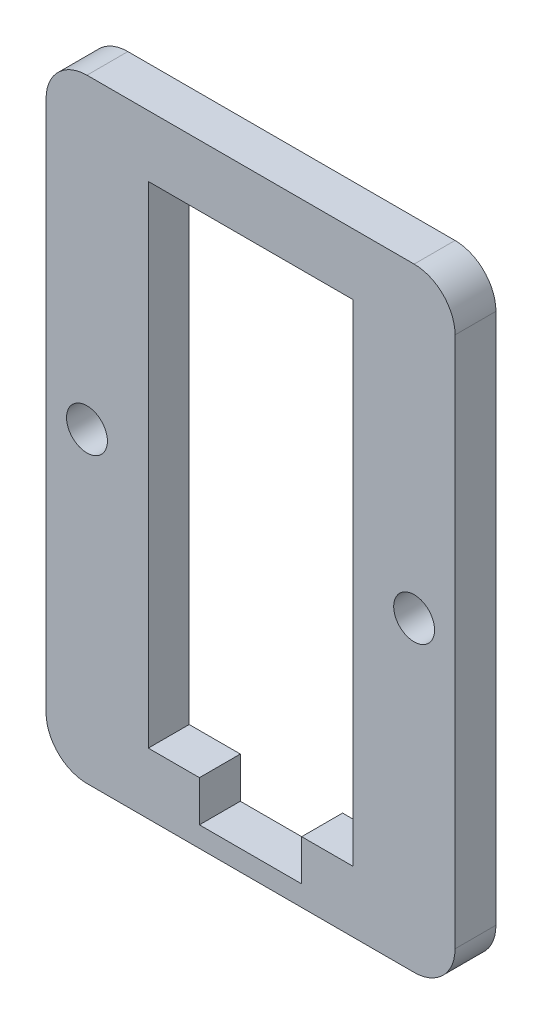
ISO-10303-21;
HEADER;
FILE_DESCRIPTION(('STEP AP214'),'2;1');
FILE_NAME('part.step','',(''),(''),'','','');
FILE_SCHEMA(('AUTOMOTIVE_DESIGN { 1 0 10303 214 1 1 1 1 }'));
ENDSEC;
DATA;
#1=APPLICATION_CONTEXT('core data for automotive mechanical design processes');
#2=APPLICATION_PROTOCOL_DEFINITION('international standard','automotive_design',2000,#1);
#3=PRODUCT_CONTEXT('',#1,'mechanical');
#4=PRODUCT('Part','Part','',(#3));
#5=PRODUCT_RELATED_PRODUCT_CATEGORY('part','',(#4));
#6=PRODUCT_DEFINITION_FORMATION('','',#4);
#7=PRODUCT_DEFINITION_CONTEXT('part definition',#1,'design');
#8=PRODUCT_DEFINITION('design','',#6,#7);
#9=PRODUCT_DEFINITION_SHAPE('','',#8);
#10=(LENGTH_UNIT() NAMED_UNIT(*) SI_UNIT(.MILLI.,.METRE.));
#11=(NAMED_UNIT(*) PLANE_ANGLE_UNIT() SI_UNIT($,.RADIAN.));
#12=(NAMED_UNIT(*) SI_UNIT($,.STERADIAN.) SOLID_ANGLE_UNIT());
#13=UNCERTAINTY_MEASURE_WITH_UNIT(LENGTH_MEASURE(1.E-05),#10,'distance_accuracy_value','');
#14=(GEOMETRIC_REPRESENTATION_CONTEXT(3) GLOBAL_UNCERTAINTY_ASSIGNED_CONTEXT((#13)) GLOBAL_UNIT_ASSIGNED_CONTEXT((#10,
#11,#12)) REPRESENTATION_CONTEXT('',''));
#15=CARTESIAN_POINT('',(0.,0.,0.));
#16=DIRECTION('',(0.,0.,1.));
#17=DIRECTION('',(1.,0.,0.));
#18=AXIS2_PLACEMENT_3D('',#15,#16,#17);
#19=CARTESIAN_POINT('',(-8.,0.,0.));
#20=DIRECTION('',(0.,0.,-1.));
#21=DIRECTION('',(1.,0.,0.));
#22=AXIS2_PLACEMENT_3D('',#19,#20,#21);
#23=CYLINDRICAL_SURFACE('',#22,1.);
#24=DIRECTION('',(0.,0.,1.));
#25=VECTOR('',#24,1.);
#26=CARTESIAN_POINT('',(-7.,0.,0.));
#27=LINE('',#26,#25);
#28=CARTESIAN_POINT('',(-7.,0.,0.));
#29=VERTEX_POINT('',#28);
#30=CARTESIAN_POINT('',(-7.,0.,2.));
#31=VERTEX_POINT('',#30);
#32=EDGE_CURVE('E9',#29,#31,#27,.T.);
#33=ORIENTED_EDGE('',*,*,#32,.T.);
#34=CARTESIAN_POINT('',(-8.,0.,2.));
#35=DIRECTION('',(0.,0.,1.));
#36=DIRECTION('',(1.,0.,0.));
#37=AXIS2_PLACEMENT_3D('',#34,#35,#36);
#38=CIRCLE('',#37,1.);
#39=EDGE_CURVE('E256',#31,#31,#38,.T.);
#40=ORIENTED_EDGE('',*,*,#39,.T.);
#41=ORIENTED_EDGE('',*,*,#32,.F.);
#42=CARTESIAN_POINT('',(-8.,0.,0.));
#43=DIRECTION('',(0.,0.,1.));
#44=DIRECTION('',(1.,0.,0.));
#45=AXIS2_PLACEMENT_3D('',#42,#43,#44);
#46=CIRCLE('',#45,1.);
#47=EDGE_CURVE('E317',#29,#29,#46,.T.);
#48=ORIENTED_EDGE('',*,*,#47,.F.);
#49=EDGE_LOOP('',(#33,#40,#41,#48));
#50=FACE_BOUND('',#49,.T.);
#51=ADVANCED_FACE('F14',(#50),#23,.F.);
#52=CARTESIAN_POINT('',(8.,0.,0.));
#53=DIRECTION('',(0.,0.,-1.));
#54=DIRECTION('',(1.,0.,0.));
#55=AXIS2_PLACEMENT_3D('',#52,#53,#54);
#56=CYLINDRICAL_SURFACE('',#55,1.);
#57=DIRECTION('',(0.,0.,1.));
#58=VECTOR('',#57,1.);
#59=CARTESIAN_POINT('',(9.,0.,0.));
#60=LINE('',#59,#58);
#61=CARTESIAN_POINT('',(9.,0.,0.));
#62=VERTEX_POINT('',#61);
#63=CARTESIAN_POINT('',(9.,0.,2.));
#64=VERTEX_POINT('',#63);
#65=EDGE_CURVE('E25',#62,#64,#60,.T.);
#66=ORIENTED_EDGE('',*,*,#65,.T.);
#67=CARTESIAN_POINT('',(8.,0.,2.));
#68=DIRECTION('',(0.,0.,1.));
#69=DIRECTION('',(1.,0.,0.));
#70=AXIS2_PLACEMENT_3D('',#67,#68,#69);
#71=CIRCLE('',#70,1.);
#72=EDGE_CURVE('E252',#64,#64,#71,.T.);
#73=ORIENTED_EDGE('',*,*,#72,.T.);
#74=ORIENTED_EDGE('',*,*,#65,.F.);
#75=CARTESIAN_POINT('',(8.,0.,0.));
#76=DIRECTION('',(0.,0.,1.));
#77=DIRECTION('',(1.,0.,0.));
#78=AXIS2_PLACEMENT_3D('',#75,#76,#77);
#79=CIRCLE('',#78,1.);
#80=EDGE_CURVE('E210',#62,#62,#79,.T.);
#81=ORIENTED_EDGE('',*,*,#80,.F.);
#82=EDGE_LOOP('',(#66,#73,#74,#81));
#83=FACE_BOUND('',#82,.T.);
#84=ADVANCED_FACE('F444',(#83),#56,.F.);
#85=CARTESIAN_POINT('',(-5.,12.,0.));
#86=DIRECTION('',(1.,0.,0.));
#87=DIRECTION('',(0.,1.,0.));
#88=AXIS2_PLACEMENT_3D('',#85,#86,#87);
#89=PLANE('',#88);
#90=DIRECTION('',(0.,0.,1.));
#91=VECTOR('',#90,1.);
#92=CARTESIAN_POINT('',(-5.,12.,0.));
#93=LINE('',#92,#91);
#94=CARTESIAN_POINT('',(-5.,12.,0.));
#95=VERTEX_POINT('',#94);
#96=CARTESIAN_POINT('',(-5.,12.,2.));
#97=VERTEX_POINT('',#96);
#98=EDGE_CURVE('E115',#95,#97,#93,.T.);
#99=ORIENTED_EDGE('',*,*,#98,.T.);
#100=DIRECTION('',(0.,-1.,0.));
#101=VECTOR('',#100,1.);
#102=CARTESIAN_POINT('',(-5.,12.,2.));
#103=LINE('',#102,#101);
#104=CARTESIAN_POINT('',(-5.,-12.,2.));
#105=VERTEX_POINT('',#104);
#106=EDGE_CURVE('E257',#97,#105,#103,.T.);
#107=ORIENTED_EDGE('',*,*,#106,.T.);
#108=DIRECTION('',(0.,0.,1.));
#109=VECTOR('',#108,1.);
#110=CARTESIAN_POINT('',(-5.,-12.,0.));
#111=LINE('',#110,#109);
#112=CARTESIAN_POINT('',(-5.,-12.,0.));
#113=VERTEX_POINT('',#112);
#114=EDGE_CURVE('E213',#113,#105,#111,.T.);
#115=ORIENTED_EDGE('',*,*,#114,.F.);
#116=DIRECTION('',(0.,-1.,0.));
#117=VECTOR('',#116,1.);
#118=CARTESIAN_POINT('',(-5.,12.,0.));
#119=LINE('',#118,#117);
#120=EDGE_CURVE('E206',#95,#113,#119,.T.);
#121=ORIENTED_EDGE('',*,*,#120,.F.);
#122=EDGE_LOOP('',(#99,#107,#115,#121));
#123=FACE_BOUND('',#122,.T.);
#124=ADVANCED_FACE('F212',(#123),#89,.T.);
#125=CARTESIAN_POINT('',(-5.,-12.,0.));
#126=DIRECTION('',(0.,1.,0.));
#127=DIRECTION('',(1.,0.,0.));
#128=AXIS2_PLACEMENT_3D('',#125,#126,#127);
#129=PLANE('',#128);
#130=ORIENTED_EDGE('',*,*,#114,.T.);
#131=DIRECTION('',(1.,0.,0.));
#132=VECTOR('',#131,1.);
#133=CARTESIAN_POINT('',(-5.,-12.,2.));
#134=LINE('',#133,#132);
#135=CARTESIAN_POINT('',(-2.5,-12.,2.));
#136=VERTEX_POINT('',#135);
#137=EDGE_CURVE('E274',#105,#136,#134,.T.);
#138=ORIENTED_EDGE('',*,*,#137,.T.);
#139=DIRECTION('',(0.,0.,1.));
#140=VECTOR('',#139,1.);
#141=CARTESIAN_POINT('',(-2.5,-12.,0.));
#142=LINE('',#141,#140);
#143=CARTESIAN_POINT('',(-2.5,-12.,0.));
#144=VERTEX_POINT('',#143);
#145=EDGE_CURVE('E334',#144,#136,#142,.T.);
#146=ORIENTED_EDGE('',*,*,#145,.F.);
#147=DIRECTION('',(1.,0.,0.));
#148=VECTOR('',#147,1.);
#149=CARTESIAN_POINT('',(-5.,-12.,0.));
#150=LINE('',#149,#148);
#151=EDGE_CURVE('E216',#113,#144,#150,.T.);
#152=ORIENTED_EDGE('',*,*,#151,.F.);
#153=EDGE_LOOP('',(#130,#138,#146,#152));
#154=FACE_BOUND('',#153,.T.);
#155=ADVANCED_FACE('F397',(#154),#129,.T.);
#156=CARTESIAN_POINT('',(-2.5,-12.,0.));
#157=DIRECTION('',(1.,0.,0.));
#158=DIRECTION('',(0.,1.,0.));
#159=AXIS2_PLACEMENT_3D('',#156,#157,#158);
#160=PLANE('',#159);
#161=ORIENTED_EDGE('',*,*,#145,.T.);
#162=DIRECTION('',(0.,-1.,0.));
#163=VECTOR('',#162,1.);
#164=CARTESIAN_POINT('',(-2.5,-12.,2.));
#165=LINE('',#164,#163);
#166=CARTESIAN_POINT('',(-2.5,-14.,2.));
#167=VERTEX_POINT('',#166);
#168=EDGE_CURVE('E240',#136,#167,#165,.T.);
#169=ORIENTED_EDGE('',*,*,#168,.T.);
#170=DIRECTION('',(0.,0.,1.));
#171=VECTOR('',#170,1.);
#172=CARTESIAN_POINT('',(-2.5,-14.,0.));
#173=LINE('',#172,#171);
#174=CARTESIAN_POINT('',(-2.5,-14.,0.));
#175=VERTEX_POINT('',#174);
#176=EDGE_CURVE('E164',#175,#167,#173,.T.);
#177=ORIENTED_EDGE('',*,*,#176,.F.);
#178=DIRECTION('',(0.,-1.,0.));
#179=VECTOR('',#178,1.);
#180=CARTESIAN_POINT('',(-2.5,-12.,0.));
#181=LINE('',#180,#179);
#182=EDGE_CURVE('E18',#144,#175,#181,.T.);
#183=ORIENTED_EDGE('',*,*,#182,.F.);
#184=EDGE_LOOP('',(#161,#169,#177,#183));
#185=FACE_BOUND('',#184,.T.);
#186=ADVANCED_FACE('F465',(#185),#160,.T.);
#187=CARTESIAN_POINT('',(-2.5,-14.,0.));
#188=DIRECTION('',(0.,1.,0.));
#189=DIRECTION('',(1.,0.,0.));
#190=AXIS2_PLACEMENT_3D('',#187,#188,#189);
#191=PLANE('',#190);
#192=ORIENTED_EDGE('',*,*,#176,.T.);
#193=DIRECTION('',(1.,0.,0.));
#194=VECTOR('',#193,1.);
#195=CARTESIAN_POINT('',(-2.5,-14.,2.));
#196=LINE('',#195,#194);
#197=CARTESIAN_POINT('',(2.5,-14.,2.));
#198=VERTEX_POINT('',#197);
#199=EDGE_CURVE('E237',#167,#198,#196,.T.);
#200=ORIENTED_EDGE('',*,*,#199,.T.);
#201=DIRECTION('',(0.,0.,1.));
#202=VECTOR('',#201,1.);
#203=CARTESIAN_POINT('',(2.5,-14.,0.));
#204=LINE('',#203,#202);
#205=CARTESIAN_POINT('',(2.5,-14.,0.));
#206=VERTEX_POINT('',#205);
#207=EDGE_CURVE('E174',#206,#198,#204,.T.);
#208=ORIENTED_EDGE('',*,*,#207,.F.);
#209=DIRECTION('',(1.,0.,0.));
#210=VECTOR('',#209,1.);
#211=CARTESIAN_POINT('',(-2.5,-14.,0.));
#212=LINE('',#211,#210);
#213=EDGE_CURVE('E281',#175,#206,#212,.T.);
#214=ORIENTED_EDGE('',*,*,#213,.F.);
#215=EDGE_LOOP('',(#192,#200,#208,#214));
#216=FACE_BOUND('',#215,.T.);
#217=ADVANCED_FACE('F453',(#216),#191,.T.);
#218=CARTESIAN_POINT('',(2.5,-12.,0.));
#219=DIRECTION('',(1.,0.,0.));
#220=DIRECTION('',(0.,1.,0.));
#221=AXIS2_PLACEMENT_3D('',#218,#219,#220);
#222=PLANE('',#221);
#223=DIRECTION('',(0.,-1.,0.));
#224=VECTOR('',#223,1.);
#225=CARTESIAN_POINT('',(2.5,-12.,0.));
#226=LINE('',#225,#224);
#227=CARTESIAN_POINT('',(2.5,-12.,0.));
#228=VERTEX_POINT('',#227);
#229=EDGE_CURVE('E278',#228,#206,#226,.T.);
#230=ORIENTED_EDGE('',*,*,#229,.T.);
#231=ORIENTED_EDGE('',*,*,#207,.T.);
#232=DIRECTION('',(0.,-1.,0.));
#233=VECTOR('',#232,1.);
#234=CARTESIAN_POINT('',(2.5,-12.,2.));
#235=LINE('',#234,#233);
#236=CARTESIAN_POINT('',(2.5,-12.,2.));
#237=VERTEX_POINT('',#236);
#238=EDGE_CURVE('E241',#237,#198,#235,.T.);
#239=ORIENTED_EDGE('',*,*,#238,.F.);
#240=DIRECTION('',(0.,0.,1.));
#241=VECTOR('',#240,1.);
#242=CARTESIAN_POINT('',(2.5,-12.,0.));
#243=LINE('',#242,#241);
#244=EDGE_CURVE('E285',#228,#237,#243,.T.);
#245=ORIENTED_EDGE('',*,*,#244,.F.);
#246=EDGE_LOOP('',(#230,#231,#239,#245));
#247=FACE_BOUND('',#246,.T.);
#248=ADVANCED_FACE('F458',(#247),#222,.F.);
#249=CARTESIAN_POINT('',(5.,-12.,0.));
#250=DIRECTION('',(0.,-1.,0.));
#251=DIRECTION('',(0.,0.,-1.));
#252=AXIS2_PLACEMENT_3D('',#249,#250,#251);
#253=PLANE('',#252);
#254=DIRECTION('',(-1.,0.,0.));
#255=VECTOR('',#254,1.);
#256=CARTESIAN_POINT('',(5.,-12.,0.));
#257=LINE('',#256,#255);
#258=CARTESIAN_POINT('',(5.,-12.,0.));
#259=VERTEX_POINT('',#258);
#260=EDGE_CURVE('E280',#259,#228,#257,.T.);
#261=ORIENTED_EDGE('',*,*,#260,.T.);
#262=ORIENTED_EDGE('',*,*,#244,.T.);
#263=DIRECTION('',(-1.,0.,0.));
#264=VECTOR('',#263,1.);
#265=CARTESIAN_POINT('',(5.,-12.,2.));
#266=LINE('',#265,#264);
#267=CARTESIAN_POINT('',(5.,-12.,2.));
#268=VERTEX_POINT('',#267);
#269=EDGE_CURVE('E251',#268,#237,#266,.T.);
#270=ORIENTED_EDGE('',*,*,#269,.F.);
#271=DIRECTION('',(0.,0.,1.));
#272=VECTOR('',#271,1.);
#273=CARTESIAN_POINT('',(5.,-12.,0.));
#274=LINE('',#273,#272);
#275=EDGE_CURVE('E95',#259,#268,#274,.T.);
#276=ORIENTED_EDGE('',*,*,#275,.F.);
#277=EDGE_LOOP('',(#261,#262,#270,#276));
#278=FACE_BOUND('',#277,.T.);
#279=ADVANCED_FACE('F388',(#278),#253,.F.);
#280=CARTESIAN_POINT('',(5.,12.,0.));
#281=DIRECTION('',(1.,0.,0.));
#282=DIRECTION('',(0.,1.,0.));
#283=AXIS2_PLACEMENT_3D('',#280,#281,#282);
#284=PLANE('',#283);
#285=DIRECTION('',(0.,-1.,0.));
#286=VECTOR('',#285,1.);
#287=CARTESIAN_POINT('',(5.,12.,0.));
#288=LINE('',#287,#286);
#289=CARTESIAN_POINT('',(5.,12.,0.));
#290=VERTEX_POINT('',#289);
#291=EDGE_CURVE('E208',#290,#259,#288,.T.);
#292=ORIENTED_EDGE('',*,*,#291,.T.);
#293=ORIENTED_EDGE('',*,*,#275,.T.);
#294=DIRECTION('',(0.,-1.,0.));
#295=VECTOR('',#294,1.);
#296=CARTESIAN_POINT('',(5.,12.,2.));
#297=LINE('',#296,#295);
#298=CARTESIAN_POINT('',(5.,12.,2.));
#299=VERTEX_POINT('',#298);
#300=EDGE_CURVE('E289',#299,#268,#297,.T.);
#301=ORIENTED_EDGE('',*,*,#300,.F.);
#302=DIRECTION('',(0.,0.,1.));
#303=VECTOR('',#302,1.);
#304=CARTESIAN_POINT('',(5.,12.,0.));
#305=LINE('',#304,#303);
#306=EDGE_CURVE('E107',#290,#299,#305,.T.);
#307=ORIENTED_EDGE('',*,*,#306,.F.);
#308=EDGE_LOOP('',(#292,#293,#301,#307));
#309=FACE_BOUND('',#308,.T.);
#310=ADVANCED_FACE('F383',(#309),#284,.F.);
#311=CARTESIAN_POINT('',(-5.,12.,0.));
#312=DIRECTION('',(0.,1.,0.));
#313=DIRECTION('',(1.,0.,0.));
#314=AXIS2_PLACEMENT_3D('',#311,#312,#313);
#315=PLANE('',#314);
#316=DIRECTION('',(1.,0.,0.));
#317=VECTOR('',#316,1.);
#318=CARTESIAN_POINT('',(-5.,12.,0.));
#319=LINE('',#318,#317);
#320=EDGE_CURVE('E195',#95,#290,#319,.T.);
#321=ORIENTED_EDGE('',*,*,#320,.T.);
#322=ORIENTED_EDGE('',*,*,#306,.T.);
#323=DIRECTION('',(1.,0.,0.));
#324=VECTOR('',#323,1.);
#325=CARTESIAN_POINT('',(-5.,12.,2.));
#326=LINE('',#325,#324);
#327=EDGE_CURVE('E198',#97,#299,#326,.T.);
#328=ORIENTED_EDGE('',*,*,#327,.F.);
#329=ORIENTED_EDGE('',*,*,#98,.F.);
#330=EDGE_LOOP('',(#321,#322,#328,#329));
#331=FACE_BOUND('',#330,.T.);
#332=ADVANCED_FACE('F194',(#331),#315,.F.);
#333=CARTESIAN_POINT('',(10.,-15.,0.));
#334=DIRECTION('',(-1.,0.,0.));
#335=DIRECTION('',(0.,0.,1.));
#336=AXIS2_PLACEMENT_3D('',#333,#334,#335);
#337=PLANE('',#336);
#338=DIRECTION('',(0.,0.,1.));
#339=VECTOR('',#338,1.);
#340=CARTESIAN_POINT('',(10.,13.,0.));
#341=LINE('',#340,#339);
#342=CARTESIAN_POINT('',(10.,13.,0.));
#343=VERTEX_POINT('',#342);
#344=CARTESIAN_POINT('',(10.,13.,2.));
#345=VERTEX_POINT('',#344);
#346=EDGE_CURVE('E227',#343,#345,#341,.T.);
#347=ORIENTED_EDGE('',*,*,#346,.T.);
#348=DIRECTION('',(0.,1.,0.));
#349=VECTOR('',#348,1.);
#350=CARTESIAN_POINT('',(10.,-15.,2.));
#351=LINE('',#350,#349);
#352=CARTESIAN_POINT('',(10.,-13.,2.));
#353=VERTEX_POINT('',#352);
#354=EDGE_CURVE('E312',#353,#345,#351,.T.);
#355=ORIENTED_EDGE('',*,*,#354,.F.);
#356=DIRECTION('',(0.,0.,1.));
#357=VECTOR('',#356,1.);
#358=CARTESIAN_POINT('',(10.,-13.,0.));
#359=LINE('',#358,#357);
#360=CARTESIAN_POINT('',(10.,-13.,0.));
#361=VERTEX_POINT('',#360);
#362=EDGE_CURVE('E230',#361,#353,#359,.T.);
#363=ORIENTED_EDGE('',*,*,#362,.F.);
#364=DIRECTION('',(0.,1.,0.));
#365=VECTOR('',#364,1.);
#366=CARTESIAN_POINT('',(10.,-15.,0.));
#367=LINE('',#366,#365);
#368=EDGE_CURVE('E235',#361,#343,#367,.T.);
#369=ORIENTED_EDGE('',*,*,#368,.T.);
#370=EDGE_LOOP('',(#347,#355,#363,#369));
#371=FACE_BOUND('',#370,.T.);
#372=ADVANCED_FACE('F454',(#371),#337,.F.);
#373=CARTESIAN_POINT('',(8.,-13.,0.));
#374=DIRECTION('',(0.,0.,1.));
#375=DIRECTION('',(0.,-1.,0.));
#376=AXIS2_PLACEMENT_3D('',#373,#374,#375);
#377=CYLINDRICAL_SURFACE('',#376,2.);
#378=CARTESIAN_POINT('',(8.,-13.,0.));
#379=DIRECTION('',(0.,0.,1.));
#380=DIRECTION('',(0.,-1.,0.));
#381=AXIS2_PLACEMENT_3D('',#378,#379,#380);
#382=CIRCLE('',#381,2.);
#383=CARTESIAN_POINT('',(8.,-15.,0.));
#384=VERTEX_POINT('',#383);
#385=EDGE_CURVE('E264',#384,#361,#382,.T.);
#386=ORIENTED_EDGE('',*,*,#385,.T.);
#387=ORIENTED_EDGE('',*,*,#362,.T.);
#388=CARTESIAN_POINT('',(8.,-13.,2.));
#389=DIRECTION('',(0.,0.,1.));
#390=DIRECTION('',(0.,-1.,0.));
#391=AXIS2_PLACEMENT_3D('',#388,#389,#390);
#392=CIRCLE('',#391,2.);
#393=CARTESIAN_POINT('',(8.,-15.,2.));
#394=VERTEX_POINT('',#393);
#395=EDGE_CURVE('E316',#394,#353,#392,.T.);
#396=ORIENTED_EDGE('',*,*,#395,.F.);
#397=DIRECTION('',(0.,0.,1.));
#398=VECTOR('',#397,1.);
#399=CARTESIAN_POINT('',(8.,-15.,0.));
#400=LINE('',#399,#398);
#401=EDGE_CURVE('E231',#384,#394,#400,.T.);
#402=ORIENTED_EDGE('',*,*,#401,.F.);
#403=EDGE_LOOP('',(#386,#387,#396,#402));
#404=FACE_BOUND('',#403,.T.);
#405=ADVANCED_FACE('F16',(#404),#377,.T.);
#406=CARTESIAN_POINT('',(8.,13.,0.));
#407=DIRECTION('',(0.,0.,1.));
#408=DIRECTION('',(1.,0.,0.));
#409=AXIS2_PLACEMENT_3D('',#406,#407,#408);
#410=CYLINDRICAL_SURFACE('',#409,2.);
#411=CARTESIAN_POINT('',(8.,13.,0.));
#412=DIRECTION('',(0.,0.,1.));
#413=DIRECTION('',(0.,-1.,0.));
#414=AXIS2_PLACEMENT_3D('',#411,#412,#413);
#415=CIRCLE('',#414,2.);
#416=CARTESIAN_POINT('',(8.,15.,0.));
#417=VERTEX_POINT('',#416);
#418=EDGE_CURVE('E232',#343,#417,#415,.T.);
#419=ORIENTED_EDGE('',*,*,#418,.T.);
#420=DIRECTION('',(0.,0.,1.));
#421=VECTOR('',#420,1.);
#422=CARTESIAN_POINT('',(8.,15.,0.));
#423=LINE('',#422,#421);
#424=CARTESIAN_POINT('',(8.,15.,2.));
#425=VERTEX_POINT('',#424);
#426=EDGE_CURVE('E127',#417,#425,#423,.T.);
#427=ORIENTED_EDGE('',*,*,#426,.T.);
#428=CARTESIAN_POINT('',(8.,13.,2.));
#429=DIRECTION('',(0.,0.,1.));
#430=DIRECTION('',(0.,-1.,0.));
#431=AXIS2_PLACEMENT_3D('',#428,#429,#430);
#432=CIRCLE('',#431,2.);
#433=EDGE_CURVE('E299',#345,#425,#432,.T.);
#434=ORIENTED_EDGE('',*,*,#433,.F.);
#435=ORIENTED_EDGE('',*,*,#346,.F.);
#436=EDGE_LOOP('',(#419,#427,#434,#435));
#437=FACE_BOUND('',#436,.T.);
#438=ADVANCED_FACE('F476',(#437),#410,.T.);
#439=CARTESIAN_POINT('',(-10.,-15.,0.));
#440=DIRECTION('',(0.,1.,0.));
#441=DIRECTION('',(1.,0.,0.));
#442=AXIS2_PLACEMENT_3D('',#439,#440,#441);
#443=PLANE('',#442);
#444=ORIENTED_EDGE('',*,*,#401,.T.);
#445=DIRECTION('',(1.,0.,0.));
#446=VECTOR('',#445,1.);
#447=CARTESIAN_POINT('',(-10.,-15.,2.));
#448=LINE('',#447,#446);
#449=CARTESIAN_POINT('',(-8.,-15.,2.));
#450=VERTEX_POINT('',#449);
#451=EDGE_CURVE('E322',#450,#394,#448,.T.);
#452=ORIENTED_EDGE('',*,*,#451,.F.);
#453=DIRECTION('',(0.,0.,1.));
#454=VECTOR('',#453,1.);
#455=CARTESIAN_POINT('',(-8.,-15.,0.));
#456=LINE('',#455,#454);
#457=CARTESIAN_POINT('',(-8.,-15.,0.));
#458=VERTEX_POINT('',#457);
#459=EDGE_CURVE('E190',#458,#450,#456,.T.);
#460=ORIENTED_EDGE('',*,*,#459,.F.);
#461=DIRECTION('',(1.,0.,0.));
#462=VECTOR('',#461,1.);
#463=CARTESIAN_POINT('',(-10.,-15.,0.));
#464=LINE('',#463,#462);
#465=EDGE_CURVE('E224',#458,#384,#464,.T.);
#466=ORIENTED_EDGE('',*,*,#465,.T.);
#467=EDGE_LOOP('',(#444,#452,#460,#466));
#468=FACE_BOUND('',#467,.T.);
#469=ADVANCED_FACE('F474',(#468),#443,.F.);
#470=CARTESIAN_POINT('',(10.,15.,0.));
#471=DIRECTION('',(0.,-1.,0.));
#472=DIRECTION('',(0.,0.,-1.));
#473=AXIS2_PLACEMENT_3D('',#470,#471,#472);
#474=PLANE('',#473);
#475=DIRECTION('',(0.,0.,1.));
#476=VECTOR('',#475,1.);
#477=CARTESIAN_POINT('',(-8.,15.,0.));
#478=LINE('',#477,#476);
#479=CARTESIAN_POINT('',(-8.,15.,0.));
#480=VERTEX_POINT('',#479);
#481=CARTESIAN_POINT('',(-8.,15.,2.));
#482=VERTEX_POINT('',#481);
#483=EDGE_CURVE('E341',#480,#482,#478,.T.);
#484=ORIENTED_EDGE('',*,*,#483,.T.);
#485=DIRECTION('',(-1.,0.,0.));
#486=VECTOR('',#485,1.);
#487=CARTESIAN_POINT('',(10.,15.,2.));
#488=LINE('',#487,#486);
#489=EDGE_CURVE('E296',#425,#482,#488,.T.);
#490=ORIENTED_EDGE('',*,*,#489,.F.);
#491=ORIENTED_EDGE('',*,*,#426,.F.);
#492=DIRECTION('',(-1.,0.,0.));
#493=VECTOR('',#492,1.);
#494=CARTESIAN_POINT('',(10.,15.,0.));
#495=LINE('',#494,#493);
#496=EDGE_CURVE('E236',#417,#480,#495,.T.);
#497=ORIENTED_EDGE('',*,*,#496,.T.);
#498=EDGE_LOOP('',(#484,#490,#491,#497));
#499=FACE_BOUND('',#498,.T.);
#500=ADVANCED_FACE('F438',(#499),#474,.F.);
#501=CARTESIAN_POINT('',(0.,-0.339926621644,2.));
#502=DIRECTION('',(0.,0.,1.));
#503=DIRECTION('',(1.,0.,0.));
#504=AXIS2_PLACEMENT_3D('',#501,#502,#503);
#505=PLANE('',#504);
#506=ORIENTED_EDGE('',*,*,#39,.F.);
#507=EDGE_LOOP('',(#506));
#508=FACE_BOUND('',#507,.T.);
#509=ORIENTED_EDGE('',*,*,#72,.F.);
#510=EDGE_LOOP('',(#509));
#511=FACE_BOUND('',#510,.T.);
#512=ORIENTED_EDGE('',*,*,#327,.T.);
#513=ORIENTED_EDGE('',*,*,#300,.T.);
#514=ORIENTED_EDGE('',*,*,#269,.T.);
#515=ORIENTED_EDGE('',*,*,#238,.T.);
#516=ORIENTED_EDGE('',*,*,#199,.F.);
#517=ORIENTED_EDGE('',*,*,#168,.F.);
#518=ORIENTED_EDGE('',*,*,#137,.F.);
#519=ORIENTED_EDGE('',*,*,#106,.F.);
#520=EDGE_LOOP('',(#512,#513,#514,#515,#516,#517,#518,#519));
#521=FACE_BOUND('',#520,.T.);
#522=DIRECTION('',(0.,-1.,0.));
#523=VECTOR('',#522,1.);
#524=CARTESIAN_POINT('',(-10.,15.,2.));
#525=LINE('',#524,#523);
#526=CARTESIAN_POINT('',(-10.,13.,2.));
#527=VERTEX_POINT('',#526);
#528=CARTESIAN_POINT('',(-10.,-13.,2.));
#529=VERTEX_POINT('',#528);
#530=EDGE_CURVE('E247',#527,#529,#525,.T.);
#531=ORIENTED_EDGE('',*,*,#530,.T.);
#532=CARTESIAN_POINT('',(-8.,-13.,2.));
#533=DIRECTION('',(0.,0.,1.));
#534=DIRECTION('',(0.,-1.,0.));
#535=AXIS2_PLACEMENT_3D('',#532,#533,#534);
#536=CIRCLE('',#535,2.);
#537=EDGE_CURVE('E326',#529,#450,#536,.T.);
#538=ORIENTED_EDGE('',*,*,#537,.T.);
#539=ORIENTED_EDGE('',*,*,#451,.T.);
#540=ORIENTED_EDGE('',*,*,#395,.T.);
#541=ORIENTED_EDGE('',*,*,#354,.T.);
#542=ORIENTED_EDGE('',*,*,#433,.T.);
#543=ORIENTED_EDGE('',*,*,#489,.T.);
#544=CARTESIAN_POINT('',(-8.,13.,2.));
#545=DIRECTION('',(0.,0.,-1.));
#546=DIRECTION('',(0.,-1.,0.));
#547=AXIS2_PLACEMENT_3D('',#544,#545,#546);
#548=CIRCLE('',#547,2.);
#549=EDGE_CURVE('E321',#527,#482,#548,.T.);
#550=ORIENTED_EDGE('',*,*,#549,.F.);
#551=EDGE_LOOP('',(#531,#538,#539,#540,#541,#542,#543,#550));
#552=FACE_BOUND('',#551,.T.);
#553=ADVANCED_FACE('F391',(#508,#511,#521,#552),#505,.T.);
#554=CARTESIAN_POINT('',(-8.,-13.,0.));
#555=DIRECTION('',(0.,0.,1.));
#556=DIRECTION('',(-1.,0.,0.));
#557=AXIS2_PLACEMENT_3D('',#554,#555,#556);
#558=CYLINDRICAL_SURFACE('',#557,2.);
#559=CARTESIAN_POINT('',(-8.,-13.,0.));
#560=DIRECTION('',(0.,0.,1.));
#561=DIRECTION('',(0.,-1.,0.));
#562=AXIS2_PLACEMENT_3D('',#559,#560,#561);
#563=CIRCLE('',#562,2.);
#564=CARTESIAN_POINT('',(-10.,-13.,0.));
#565=VERTEX_POINT('',#564);
#566=EDGE_CURVE('E217',#565,#458,#563,.T.);
#567=ORIENTED_EDGE('',*,*,#566,.T.);
#568=ORIENTED_EDGE('',*,*,#459,.T.);
#569=ORIENTED_EDGE('',*,*,#537,.F.);
#570=DIRECTION('',(0.,0.,1.));
#571=VECTOR('',#570,1.);
#572=CARTESIAN_POINT('',(-10.,-13.,0.));
#573=LINE('',#572,#571);
#574=EDGE_CURVE('E261',#565,#529,#573,.T.);
#575=ORIENTED_EDGE('',*,*,#574,.F.);
#576=EDGE_LOOP('',(#567,#568,#569,#575));
#577=FACE_BOUND('',#576,.T.);
#578=ADVANCED_FACE('F427',(#577),#558,.T.);
#579=CARTESIAN_POINT('',(-8.,13.,0.));
#580=DIRECTION('',(0.,0.,1.));
#581=DIRECTION('',(-1.,0.,0.));
#582=AXIS2_PLACEMENT_3D('',#579,#580,#581);
#583=CYLINDRICAL_SURFACE('',#582,2.);
#584=DIRECTION('',(0.,0.,1.));
#585=VECTOR('',#584,1.);
#586=CARTESIAN_POINT('',(-10.,13.,0.));
#587=LINE('',#586,#585);
#588=CARTESIAN_POINT('',(-10.,13.,0.));
#589=VERTEX_POINT('',#588);
#590=EDGE_CURVE('E242',#589,#527,#587,.T.);
#591=ORIENTED_EDGE('',*,*,#590,.T.);
#592=ORIENTED_EDGE('',*,*,#549,.T.);
#593=ORIENTED_EDGE('',*,*,#483,.F.);
#594=CARTESIAN_POINT('',(-8.,13.,0.));
#595=DIRECTION('',(0.,0.,-1.));
#596=DIRECTION('',(0.,-1.,0.));
#597=AXIS2_PLACEMENT_3D('',#594,#595,#596);
#598=CIRCLE('',#597,2.);
#599=EDGE_CURVE('E268',#589,#480,#598,.T.);
#600=ORIENTED_EDGE('',*,*,#599,.F.);
#601=EDGE_LOOP('',(#591,#592,#593,#600));
#602=FACE_BOUND('',#601,.T.);
#603=ADVANCED_FACE('F429',(#602),#583,.T.);
#604=CARTESIAN_POINT('',(0.,-0.339926621644,0.));
#605=DIRECTION('',(0.,0.,1.));
#606=DIRECTION('',(1.,0.,0.));
#607=AXIS2_PLACEMENT_3D('',#604,#605,#606);
#608=PLANE('',#607);
#609=ORIENTED_EDGE('',*,*,#47,.T.);
#610=EDGE_LOOP('',(#609));
#611=FACE_BOUND('',#610,.T.);
#612=ORIENTED_EDGE('',*,*,#80,.T.);
#613=EDGE_LOOP('',(#612));
#614=FACE_BOUND('',#613,.T.);
#615=ORIENTED_EDGE('',*,*,#120,.T.);
#616=ORIENTED_EDGE('',*,*,#151,.T.);
#617=ORIENTED_EDGE('',*,*,#182,.T.);
#618=ORIENTED_EDGE('',*,*,#213,.T.);
#619=ORIENTED_EDGE('',*,*,#229,.F.);
#620=ORIENTED_EDGE('',*,*,#260,.F.);
#621=ORIENTED_EDGE('',*,*,#291,.F.);
#622=ORIENTED_EDGE('',*,*,#320,.F.);
#623=EDGE_LOOP('',(#615,#616,#617,#618,#619,#620,#621,#622));
#624=FACE_BOUND('',#623,.T.);
#625=ORIENTED_EDGE('',*,*,#599,.T.);
#626=ORIENTED_EDGE('',*,*,#496,.F.);
#627=ORIENTED_EDGE('',*,*,#418,.F.);
#628=ORIENTED_EDGE('',*,*,#368,.F.);
#629=ORIENTED_EDGE('',*,*,#385,.F.);
#630=ORIENTED_EDGE('',*,*,#465,.F.);
#631=ORIENTED_EDGE('',*,*,#566,.F.);
#632=DIRECTION('',(0.,-1.,0.));
#633=VECTOR('',#632,1.);
#634=CARTESIAN_POINT('',(-10.,15.,0.));
#635=LINE('',#634,#633);
#636=EDGE_CURVE('E246',#589,#565,#635,.T.);
#637=ORIENTED_EDGE('',*,*,#636,.F.);
#638=EDGE_LOOP('',(#625,#626,#627,#628,#629,#630,#631,#637));
#639=FACE_BOUND('',#638,.T.);
#640=ADVANCED_FACE('F203',(#611,#614,#624,#639),#608,.F.);
#641=CARTESIAN_POINT('',(-10.,15.,0.));
#642=DIRECTION('',(1.,0.,0.));
#643=DIRECTION('',(0.,1.,0.));
#644=AXIS2_PLACEMENT_3D('',#641,#642,#643);
#645=PLANE('',#644);
#646=ORIENTED_EDGE('',*,*,#574,.T.);
#647=ORIENTED_EDGE('',*,*,#530,.F.);
#648=ORIENTED_EDGE('',*,*,#590,.F.);
#649=ORIENTED_EDGE('',*,*,#636,.T.);
#650=EDGE_LOOP('',(#646,#647,#648,#649));
#651=FACE_BOUND('',#650,.T.);
#652=ADVANCED_FACE('F425',(#651),#645,.F.);
#653=CLOSED_SHELL('',(#51,#84,#124,#155,#186,#217,#248,#279,#310,#332,#372,#405,#438,#469,#500,
#553,#578,#603,#640,#652));
#654=MANIFOLD_SOLID_BREP('B1',#653);
#655=ADVANCED_BREP_SHAPE_REPRESENTATION('',(#18,#654),#14);
#656=SHAPE_DEFINITION_REPRESENTATION(#9,#655);
ENDSEC;
END-ISO-10303-21;
